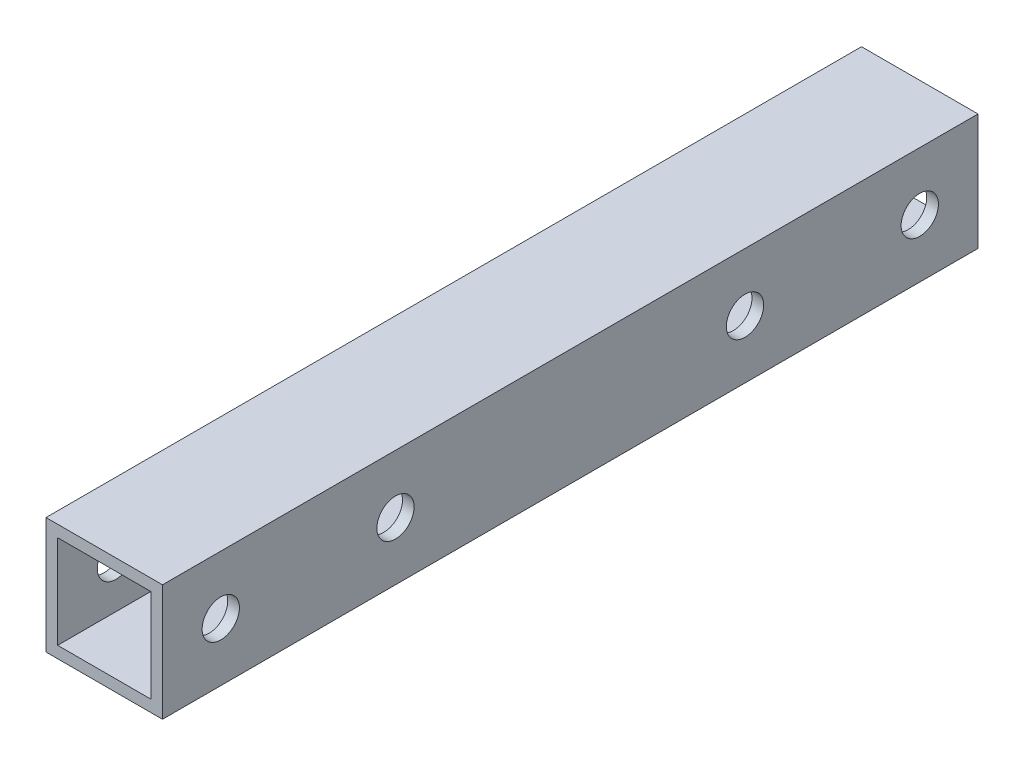
ISO-10303-21;
HEADER;
FILE_DESCRIPTION(('STEP AP214'),'2;1');
FILE_NAME('part.step','',(''),(''),'','','');
FILE_SCHEMA(('AUTOMOTIVE_DESIGN { 1 0 10303 214 1 1 1 1 }'));
ENDSEC;
DATA;
#1=APPLICATION_CONTEXT('core data for automotive mechanical design processes');
#2=APPLICATION_PROTOCOL_DEFINITION('international standard','automotive_design',2000,#1);
#3=PRODUCT_CONTEXT('',#1,'mechanical');
#4=PRODUCT('Part','Part','',(#3));
#5=PRODUCT_RELATED_PRODUCT_CATEGORY('part','',(#4));
#6=PRODUCT_DEFINITION_FORMATION('','',#4);
#7=PRODUCT_DEFINITION_CONTEXT('part definition',#1,'design');
#8=PRODUCT_DEFINITION('design','',#6,#7);
#9=PRODUCT_DEFINITION_SHAPE('','',#8);
#10=(LENGTH_UNIT() NAMED_UNIT(*) SI_UNIT(.MILLI.,.METRE.));
#11=(NAMED_UNIT(*) PLANE_ANGLE_UNIT() SI_UNIT($,.RADIAN.));
#12=(NAMED_UNIT(*) SI_UNIT($,.STERADIAN.) SOLID_ANGLE_UNIT());
#13=UNCERTAINTY_MEASURE_WITH_UNIT(LENGTH_MEASURE(1.E-05),#10,'distance_accuracy_value','');
#14=(GEOMETRIC_REPRESENTATION_CONTEXT(3) GLOBAL_UNCERTAINTY_ASSIGNED_CONTEXT((#13)) GLOBAL_UNIT_ASSIGNED_CONTEXT((#10,
#11,#12)) REPRESENTATION_CONTEXT('',''));
#15=CARTESIAN_POINT('',(0.,0.,0.));
#16=DIRECTION('',(0.,0.,1.));
#17=DIRECTION('',(1.,0.,0.));
#18=AXIS2_PLACEMENT_3D('',#15,#16,#17);
#19=CARTESIAN_POINT('',(0.,0.,70.));
#20=DIRECTION('',(0.,0.,1.));
#21=DIRECTION('',(1.,0.,0.));
#22=AXIS2_PLACEMENT_3D('',#19,#20,#21);
#23=PLANE('',#22);
#24=DIRECTION('',(0.,1.,0.));
#25=VECTOR('',#24,1.);
#26=CARTESIAN_POINT('',(5.,-5.,70.));
#27=LINE('',#26,#25);
#28=CARTESIAN_POINT('',(5.,-5.,70.));
#29=VERTEX_POINT('',#28);
#30=CARTESIAN_POINT('',(5.,5.,70.));
#31=VERTEX_POINT('',#30);
#32=EDGE_CURVE('E167',#29,#31,#27,.T.);
#33=ORIENTED_EDGE('',*,*,#32,.T.);
#34=DIRECTION('',(-1.,0.,0.));
#35=VECTOR('',#34,1.);
#36=CARTESIAN_POINT('',(-5.,5.,70.));
#37=LINE('',#36,#35);
#38=CARTESIAN_POINT('',(-5.,5.,70.));
#39=VERTEX_POINT('',#38);
#40=EDGE_CURVE('E170',#31,#39,#37,.T.);
#41=ORIENTED_EDGE('',*,*,#40,.T.);
#42=DIRECTION('',(0.,-1.,0.));
#43=VECTOR('',#42,1.);
#44=CARTESIAN_POINT('',(-5.,-5.,70.));
#45=LINE('',#44,#43);
#46=CARTESIAN_POINT('',(-5.,-5.,70.));
#47=VERTEX_POINT('',#46);
#48=EDGE_CURVE('E173',#39,#47,#45,.T.);
#49=ORIENTED_EDGE('',*,*,#48,.T.);
#50=DIRECTION('',(1.,0.,0.));
#51=VECTOR('',#50,1.);
#52=CARTESIAN_POINT('',(-5.,-5.,70.));
#53=LINE('',#52,#51);
#54=EDGE_CURVE('E175',#47,#29,#53,.T.);
#55=ORIENTED_EDGE('',*,*,#54,.T.);
#56=EDGE_LOOP('',(#33,#41,#49,#55));
#57=FACE_BOUND('',#56,.T.);
#58=DIRECTION('',(-1.,0.,0.));
#59=VECTOR('',#58,1.);
#60=CARTESIAN_POINT('',(0.,4.,70.));
#61=LINE('',#60,#59);
#62=CARTESIAN_POINT('',(4.,4.,70.));
#63=VERTEX_POINT('',#62);
#64=CARTESIAN_POINT('',(-4.,4.,70.));
#65=VERTEX_POINT('',#64);
#66=EDGE_CURVE('E137',#63,#65,#61,.T.);
#67=ORIENTED_EDGE('',*,*,#66,.F.);
#68=DIRECTION('',(0.,1.,0.));
#69=VECTOR('',#68,1.);
#70=CARTESIAN_POINT('',(4.,0.,70.));
#71=LINE('',#70,#69);
#72=CARTESIAN_POINT('',(4.,-4.,70.));
#73=VERTEX_POINT('',#72);
#74=EDGE_CURVE('E129',#73,#63,#71,.T.);
#75=ORIENTED_EDGE('',*,*,#74,.F.);
#76=DIRECTION('',(1.,0.,0.));
#77=VECTOR('',#76,1.);
#78=CARTESIAN_POINT('',(0.,-4.,70.));
#79=LINE('',#78,#77);
#80=CARTESIAN_POINT('',(-4.,-4.,70.));
#81=VERTEX_POINT('',#80);
#82=EDGE_CURVE('E151',#81,#73,#79,.T.);
#83=ORIENTED_EDGE('',*,*,#82,.F.);
#84=DIRECTION('',(0.,-1.,0.));
#85=VECTOR('',#84,1.);
#86=CARTESIAN_POINT('',(-4.,0.,70.));
#87=LINE('',#86,#85);
#88=EDGE_CURVE('E149',#65,#81,#87,.T.);
#89=ORIENTED_EDGE('',*,*,#88,.F.);
#90=EDGE_LOOP('',(#67,#75,#83,#89));
#91=FACE_BOUND('',#90,.T.);
#92=ADVANCED_FACE('F62',(#57,#91),#23,.T.);
#93=CARTESIAN_POINT('',(0.,0.,0.));
#94=DIRECTION('',(0.,0.,1.));
#95=DIRECTION('',(1.,0.,0.));
#96=AXIS2_PLACEMENT_3D('',#93,#94,#95);
#97=PLANE('',#96);
#98=DIRECTION('',(0.,1.,0.));
#99=VECTOR('',#98,1.);
#100=CARTESIAN_POINT('',(5.,-5.,0.));
#101=LINE('',#100,#99);
#102=CARTESIAN_POINT('',(5.,-5.,0.));
#103=VERTEX_POINT('',#102);
#104=CARTESIAN_POINT('',(5.,5.,0.));
#105=VERTEX_POINT('',#104);
#106=EDGE_CURVE('E145',#103,#105,#101,.T.);
#107=ORIENTED_EDGE('',*,*,#106,.F.);
#108=DIRECTION('',(1.,0.,0.));
#109=VECTOR('',#108,1.);
#110=CARTESIAN_POINT('',(-5.,-5.,0.));
#111=LINE('',#110,#109);
#112=CARTESIAN_POINT('',(-5.,-5.,0.));
#113=VERTEX_POINT('',#112);
#114=EDGE_CURVE('E171',#113,#103,#111,.T.);
#115=ORIENTED_EDGE('',*,*,#114,.F.);
#116=DIRECTION('',(0.,-1.,0.));
#117=VECTOR('',#116,1.);
#118=CARTESIAN_POINT('',(-5.,-5.,0.));
#119=LINE('',#118,#117);
#120=CARTESIAN_POINT('',(-5.,5.,0.));
#121=VERTEX_POINT('',#120);
#122=EDGE_CURVE('E182',#121,#113,#119,.T.);
#123=ORIENTED_EDGE('',*,*,#122,.F.);
#124=DIRECTION('',(-1.,0.,0.));
#125=VECTOR('',#124,1.);
#126=CARTESIAN_POINT('',(-5.,5.,0.));
#127=LINE('',#126,#125);
#128=EDGE_CURVE('E180',#105,#121,#127,.T.);
#129=ORIENTED_EDGE('',*,*,#128,.F.);
#130=EDGE_LOOP('',(#107,#115,#123,#129));
#131=FACE_BOUND('',#130,.T.);
#132=DIRECTION('',(0.,1.,0.));
#133=VECTOR('',#132,1.);
#134=CARTESIAN_POINT('',(4.,0.,0.));
#135=LINE('',#134,#133);
#136=CARTESIAN_POINT('',(4.,-4.,0.));
#137=VERTEX_POINT('',#136);
#138=CARTESIAN_POINT('',(4.,4.,0.));
#139=VERTEX_POINT('',#138);
#140=EDGE_CURVE('E87',#137,#139,#135,.T.);
#141=ORIENTED_EDGE('',*,*,#140,.T.);
#142=DIRECTION('',(-1.,0.,0.));
#143=VECTOR('',#142,1.);
#144=CARTESIAN_POINT('',(0.,4.,0.));
#145=LINE('',#144,#143);
#146=CARTESIAN_POINT('',(-4.,4.,0.));
#147=VERTEX_POINT('',#146);
#148=EDGE_CURVE('E144',#139,#147,#145,.T.);
#149=ORIENTED_EDGE('',*,*,#148,.T.);
#150=DIRECTION('',(0.,-1.,0.));
#151=VECTOR('',#150,1.);
#152=CARTESIAN_POINT('',(-4.,0.,0.));
#153=LINE('',#152,#151);
#154=CARTESIAN_POINT('',(-4.,-4.,0.));
#155=VERTEX_POINT('',#154);
#156=EDGE_CURVE('E159',#147,#155,#153,.T.);
#157=ORIENTED_EDGE('',*,*,#156,.T.);
#158=DIRECTION('',(1.,0.,0.));
#159=VECTOR('',#158,1.);
#160=CARTESIAN_POINT('',(0.,-4.,0.));
#161=LINE('',#160,#159);
#162=EDGE_CURVE('E138',#155,#137,#161,.T.);
#163=ORIENTED_EDGE('',*,*,#162,.T.);
#164=EDGE_LOOP('',(#141,#149,#157,#163));
#165=FACE_BOUND('',#164,.T.);
#166=ADVANCED_FACE('F257',(#131,#165),#97,.F.);
#167=CARTESIAN_POINT('',(5.,-5.,70.));
#168=DIRECTION('',(-1.,0.,0.));
#169=DIRECTION('',(0.,0.,1.));
#170=AXIS2_PLACEMENT_3D('',#167,#168,#169);
#171=PLANE('',#170);
#172=CARTESIAN_POINT('',(5.,0.,50.));
#173=DIRECTION('',(1.,0.,0.));
#174=DIRECTION('',(0.,0.,-1.));
#175=AXIS2_PLACEMENT_3D('',#172,#173,#174);
#176=CIRCLE('',#175,1.60000000000001);
#177=CARTESIAN_POINT('',(5.,0.,48.4));
#178=VERTEX_POINT('',#177);
#179=EDGE_CURVE('E232',#178,#178,#176,.T.);
#180=ORIENTED_EDGE('',*,*,#179,.F.);
#181=EDGE_LOOP('',(#180));
#182=FACE_BOUND('',#181,.T.);
#183=CARTESIAN_POINT('',(5.,0.,65.));
#184=DIRECTION('',(1.,0.,0.));
#185=DIRECTION('',(0.,0.,-1.));
#186=AXIS2_PLACEMENT_3D('',#183,#184,#185);
#187=CIRCLE('',#186,1.60000000000001);
#188=CARTESIAN_POINT('',(5.,0.,63.4));
#189=VERTEX_POINT('',#188);
#190=EDGE_CURVE('E225',#189,#189,#187,.T.);
#191=ORIENTED_EDGE('',*,*,#190,.F.);
#192=EDGE_LOOP('',(#191));
#193=FACE_BOUND('',#192,.T.);
#194=CARTESIAN_POINT('',(5.,0.,5.));
#195=DIRECTION('',(1.,0.,0.));
#196=DIRECTION('',(0.,0.,-1.));
#197=AXIS2_PLACEMENT_3D('',#194,#195,#196);
#198=CIRCLE('',#197,1.6);
#199=CARTESIAN_POINT('',(5.,0.,3.4));
#200=VERTEX_POINT('',#199);
#201=EDGE_CURVE('E219',#200,#200,#198,.T.);
#202=ORIENTED_EDGE('',*,*,#201,.F.);
#203=EDGE_LOOP('',(#202));
#204=FACE_BOUND('',#203,.T.);
#205=CARTESIAN_POINT('',(5.,0.,20.));
#206=DIRECTION('',(1.,0.,0.));
#207=DIRECTION('',(0.,0.,-1.));
#208=AXIS2_PLACEMENT_3D('',#205,#206,#207);
#209=CIRCLE('',#208,1.6);
#210=CARTESIAN_POINT('',(5.,0.,18.4));
#211=VERTEX_POINT('',#210);
#212=EDGE_CURVE('E212',#211,#211,#209,.T.);
#213=ORIENTED_EDGE('',*,*,#212,.F.);
#214=EDGE_LOOP('',(#213));
#215=FACE_BOUND('',#214,.T.);
#216=ORIENTED_EDGE('',*,*,#106,.T.);
#217=DIRECTION('',(0.,0.,-1.));
#218=VECTOR('',#217,1.);
#219=CARTESIAN_POINT('',(5.,5.,70.));
#220=LINE('',#219,#218);
#221=EDGE_CURVE('E12',#31,#105,#220,.T.);
#222=ORIENTED_EDGE('',*,*,#221,.F.);
#223=ORIENTED_EDGE('',*,*,#32,.F.);
#224=DIRECTION('',(0.,0.,-1.));
#225=VECTOR('',#224,1.);
#226=CARTESIAN_POINT('',(5.,-5.,70.));
#227=LINE('',#226,#225);
#228=EDGE_CURVE('E177',#29,#103,#227,.T.);
#229=ORIENTED_EDGE('',*,*,#228,.T.);
#230=EDGE_LOOP('',(#216,#222,#223,#229));
#231=FACE_BOUND('',#230,.T.);
#232=ADVANCED_FACE('F64',(#182,#193,#204,#215,#231),#171,.F.);
#233=CARTESIAN_POINT('',(-5.,5.,70.));
#234=DIRECTION('',(0.,-1.,0.));
#235=DIRECTION('',(0.,0.,-1.));
#236=AXIS2_PLACEMENT_3D('',#233,#234,#235);
#237=PLANE('',#236);
#238=ORIENTED_EDGE('',*,*,#128,.T.);
#239=DIRECTION('',(0.,0.,-1.));
#240=VECTOR('',#239,1.);
#241=CARTESIAN_POINT('',(-5.,5.,70.));
#242=LINE('',#241,#240);
#243=EDGE_CURVE('E71',#39,#121,#242,.T.);
#244=ORIENTED_EDGE('',*,*,#243,.F.);
#245=ORIENTED_EDGE('',*,*,#40,.F.);
#246=ORIENTED_EDGE('',*,*,#221,.T.);
#247=EDGE_LOOP('',(#238,#244,#245,#246));
#248=FACE_BOUND('',#247,.T.);
#249=ADVANCED_FACE('F285',(#248),#237,.F.);
#250=CARTESIAN_POINT('',(-5.,-5.,70.));
#251=DIRECTION('',(1.,0.,0.));
#252=DIRECTION('',(0.,0.,-1.));
#253=AXIS2_PLACEMENT_3D('',#250,#251,#252);
#254=PLANE('',#253);
#255=CARTESIAN_POINT('',(-5.,0.,50.));
#256=DIRECTION('',(1.,0.,0.));
#257=DIRECTION('',(0.,0.,-1.));
#258=AXIS2_PLACEMENT_3D('',#255,#256,#257);
#259=CIRCLE('',#258,1.60000000000001);
#260=CARTESIAN_POINT('',(-5.,0.,48.4));
#261=VERTEX_POINT('',#260);
#262=EDGE_CURVE('E235',#261,#261,#259,.T.);
#263=ORIENTED_EDGE('',*,*,#262,.T.);
#264=EDGE_LOOP('',(#263));
#265=FACE_BOUND('',#264,.T.);
#266=CARTESIAN_POINT('',(-5.,0.,65.));
#267=DIRECTION('',(1.,0.,0.));
#268=DIRECTION('',(0.,0.,-1.));
#269=AXIS2_PLACEMENT_3D('',#266,#267,#268);
#270=CIRCLE('',#269,1.60000000000001);
#271=CARTESIAN_POINT('',(-5.,0.,63.4));
#272=VERTEX_POINT('',#271);
#273=EDGE_CURVE('E196',#272,#272,#270,.T.);
#274=ORIENTED_EDGE('',*,*,#273,.T.);
#275=EDGE_LOOP('',(#274));
#276=FACE_BOUND('',#275,.T.);
#277=CARTESIAN_POINT('',(-5.,0.,5.));
#278=DIRECTION('',(1.,0.,0.));
#279=DIRECTION('',(0.,0.,-1.));
#280=AXIS2_PLACEMENT_3D('',#277,#278,#279);
#281=CIRCLE('',#280,1.6);
#282=CARTESIAN_POINT('',(-5.,0.,3.4));
#283=VERTEX_POINT('',#282);
#284=EDGE_CURVE('E222',#283,#283,#281,.T.);
#285=ORIENTED_EDGE('',*,*,#284,.T.);
#286=EDGE_LOOP('',(#285));
#287=FACE_BOUND('',#286,.T.);
#288=CARTESIAN_POINT('',(-5.,0.,20.));
#289=DIRECTION('',(1.,0.,0.));
#290=DIRECTION('',(0.,0.,-1.));
#291=AXIS2_PLACEMENT_3D('',#288,#289,#290);
#292=CIRCLE('',#291,1.6);
#293=CARTESIAN_POINT('',(-5.,0.,18.4));
#294=VERTEX_POINT('',#293);
#295=EDGE_CURVE('E215',#294,#294,#292,.T.);
#296=ORIENTED_EDGE('',*,*,#295,.T.);
#297=EDGE_LOOP('',(#296));
#298=FACE_BOUND('',#297,.T.);
#299=ORIENTED_EDGE('',*,*,#122,.T.);
#300=DIRECTION('',(0.,0.,-1.));
#301=VECTOR('',#300,1.);
#302=CARTESIAN_POINT('',(-5.,-5.,70.));
#303=LINE('',#302,#301);
#304=EDGE_CURVE('E187',#47,#113,#303,.T.);
#305=ORIENTED_EDGE('',*,*,#304,.F.);
#306=ORIENTED_EDGE('',*,*,#48,.F.);
#307=ORIENTED_EDGE('',*,*,#243,.T.);
#308=EDGE_LOOP('',(#299,#305,#306,#307));
#309=FACE_BOUND('',#308,.T.);
#310=ADVANCED_FACE('F282',(#265,#276,#287,#298,#309),#254,.F.);
#311=CARTESIAN_POINT('',(-5.,-5.,70.));
#312=DIRECTION('',(0.,1.,0.));
#313=DIRECTION('',(0.,0.,1.));
#314=AXIS2_PLACEMENT_3D('',#311,#312,#313);
#315=PLANE('',#314);
#316=ORIENTED_EDGE('',*,*,#114,.T.);
#317=ORIENTED_EDGE('',*,*,#228,.F.);
#318=ORIENTED_EDGE('',*,*,#54,.F.);
#319=ORIENTED_EDGE('',*,*,#304,.T.);
#320=EDGE_LOOP('',(#316,#317,#318,#319));
#321=FACE_BOUND('',#320,.T.);
#322=ADVANCED_FACE('F279',(#321),#315,.F.);
#323=CARTESIAN_POINT('',(4.,0.,70.));
#324=DIRECTION('',(-1.,0.,0.));
#325=DIRECTION('',(0.,0.,1.));
#326=AXIS2_PLACEMENT_3D('',#323,#324,#325);
#327=PLANE('',#326);
#328=CARTESIAN_POINT('',(4.,0.,50.));
#329=DIRECTION('',(-1.,0.,0.));
#330=DIRECTION('',(0.,0.,1.));
#331=AXIS2_PLACEMENT_3D('',#328,#329,#330);
#332=CIRCLE('',#331,1.60000000000001);
#333=CARTESIAN_POINT('',(4.,0.,51.6));
#334=VERTEX_POINT('',#333);
#335=EDGE_CURVE('E216',#334,#334,#332,.T.);
#336=ORIENTED_EDGE('',*,*,#335,.F.);
#337=EDGE_LOOP('',(#336));
#338=FACE_BOUND('',#337,.T.);
#339=CARTESIAN_POINT('',(4.,0.,65.));
#340=DIRECTION('',(-1.,0.,0.));
#341=DIRECTION('',(0.,0.,1.));
#342=AXIS2_PLACEMENT_3D('',#339,#340,#341);
#343=CIRCLE('',#342,1.60000000000001);
#344=CARTESIAN_POINT('',(4.,0.,66.6));
#345=VERTEX_POINT('',#344);
#346=EDGE_CURVE('E157',#345,#345,#343,.T.);
#347=ORIENTED_EDGE('',*,*,#346,.F.);
#348=EDGE_LOOP('',(#347));
#349=FACE_BOUND('',#348,.T.);
#350=CARTESIAN_POINT('',(4.,0.,5.));
#351=DIRECTION('',(-1.,0.,0.));
#352=DIRECTION('',(0.,0.,1.));
#353=AXIS2_PLACEMENT_3D('',#350,#351,#352);
#354=CIRCLE('',#353,1.6);
#355=CARTESIAN_POINT('',(4.,0.,6.6));
#356=VERTEX_POINT('',#355);
#357=EDGE_CURVE('E199',#356,#356,#354,.T.);
#358=ORIENTED_EDGE('',*,*,#357,.F.);
#359=EDGE_LOOP('',(#358));
#360=FACE_BOUND('',#359,.T.);
#361=CARTESIAN_POINT('',(4.,0.,20.));
#362=DIRECTION('',(-1.,0.,0.));
#363=DIRECTION('',(0.,0.,1.));
#364=AXIS2_PLACEMENT_3D('',#361,#362,#363);
#365=CIRCLE('',#364,1.6);
#366=CARTESIAN_POINT('',(4.,0.,21.6));
#367=VERTEX_POINT('',#366);
#368=EDGE_CURVE('E195',#367,#367,#365,.T.);
#369=ORIENTED_EDGE('',*,*,#368,.F.);
#370=EDGE_LOOP('',(#369));
#371=FACE_BOUND('',#370,.T.);
#372=ORIENTED_EDGE('',*,*,#140,.F.);
#373=DIRECTION('',(0.,0.,-1.));
#374=VECTOR('',#373,1.);
#375=CARTESIAN_POINT('',(4.,-4.,70.));
#376=LINE('',#375,#374);
#377=EDGE_CURVE('E133',#73,#137,#376,.T.);
#378=ORIENTED_EDGE('',*,*,#377,.F.);
#379=ORIENTED_EDGE('',*,*,#74,.T.);
#380=DIRECTION('',(0.,0.,-1.));
#381=VECTOR('',#380,1.);
#382=CARTESIAN_POINT('',(4.,4.,70.));
#383=LINE('',#382,#381);
#384=EDGE_CURVE('E132',#63,#139,#383,.T.);
#385=ORIENTED_EDGE('',*,*,#384,.T.);
#386=EDGE_LOOP('',(#372,#378,#379,#385));
#387=FACE_BOUND('',#386,.T.);
#388=ADVANCED_FACE('F131',(#338,#349,#360,#371,#387),#327,.T.);
#389=CARTESIAN_POINT('',(0.,4.,70.));
#390=DIRECTION('',(0.,-1.,0.));
#391=DIRECTION('',(0.,0.,-1.));
#392=AXIS2_PLACEMENT_3D('',#389,#390,#391);
#393=PLANE('',#392);
#394=ORIENTED_EDGE('',*,*,#148,.F.);
#395=ORIENTED_EDGE('',*,*,#384,.F.);
#396=ORIENTED_EDGE('',*,*,#66,.T.);
#397=DIRECTION('',(0.,0.,-1.));
#398=VECTOR('',#397,1.);
#399=CARTESIAN_POINT('',(-4.,4.,70.));
#400=LINE('',#399,#398);
#401=EDGE_CURVE('E146',#65,#147,#400,.T.);
#402=ORIENTED_EDGE('',*,*,#401,.T.);
#403=EDGE_LOOP('',(#394,#395,#396,#402));
#404=FACE_BOUND('',#403,.T.);
#405=ADVANCED_FACE('F141',(#404),#393,.T.);
#406=CARTESIAN_POINT('',(-4.,0.,70.));
#407=DIRECTION('',(1.,0.,0.));
#408=DIRECTION('',(0.,0.,-1.));
#409=AXIS2_PLACEMENT_3D('',#406,#407,#408);
#410=PLANE('',#409);
#411=CARTESIAN_POINT('',(-4.,0.,50.));
#412=DIRECTION('',(1.,0.,0.));
#413=DIRECTION('',(0.,0.,-1.));
#414=AXIS2_PLACEMENT_3D('',#411,#412,#413);
#415=CIRCLE('',#414,1.60000000000001);
#416=CARTESIAN_POINT('',(-4.,0.,48.4));
#417=VERTEX_POINT('',#416);
#418=EDGE_CURVE('E66',#417,#417,#415,.T.);
#419=ORIENTED_EDGE('',*,*,#418,.F.);
#420=EDGE_LOOP('',(#419));
#421=FACE_BOUND('',#420,.T.);
#422=CARTESIAN_POINT('',(-4.,0.,65.));
#423=DIRECTION('',(1.,0.,0.));
#424=DIRECTION('',(0.,0.,-1.));
#425=AXIS2_PLACEMENT_3D('',#422,#423,#424);
#426=CIRCLE('',#425,1.60000000000001);
#427=CARTESIAN_POINT('',(-4.,0.,63.4));
#428=VERTEX_POINT('',#427);
#429=EDGE_CURVE('E200',#428,#428,#426,.T.);
#430=ORIENTED_EDGE('',*,*,#429,.F.);
#431=EDGE_LOOP('',(#430));
#432=FACE_BOUND('',#431,.T.);
#433=CARTESIAN_POINT('',(-4.,0.,5.));
#434=DIRECTION('',(1.,0.,0.));
#435=DIRECTION('',(0.,0.,-1.));
#436=AXIS2_PLACEMENT_3D('',#433,#434,#435);
#437=CIRCLE('',#436,1.6);
#438=CARTESIAN_POINT('',(-4.,0.,3.4));
#439=VERTEX_POINT('',#438);
#440=EDGE_CURVE('E197',#439,#439,#437,.T.);
#441=ORIENTED_EDGE('',*,*,#440,.F.);
#442=EDGE_LOOP('',(#441));
#443=FACE_BOUND('',#442,.T.);
#444=CARTESIAN_POINT('',(-4.,0.,20.));
#445=DIRECTION('',(1.,0.,0.));
#446=DIRECTION('',(0.,0.,-1.));
#447=AXIS2_PLACEMENT_3D('',#444,#445,#446);
#448=CIRCLE('',#447,1.6);
#449=CARTESIAN_POINT('',(-4.,0.,18.4));
#450=VERTEX_POINT('',#449);
#451=EDGE_CURVE('E192',#450,#450,#448,.T.);
#452=ORIENTED_EDGE('',*,*,#451,.F.);
#453=EDGE_LOOP('',(#452));
#454=FACE_BOUND('',#453,.T.);
#455=ORIENTED_EDGE('',*,*,#156,.F.);
#456=ORIENTED_EDGE('',*,*,#401,.F.);
#457=ORIENTED_EDGE('',*,*,#88,.T.);
#458=DIRECTION('',(0.,0.,-1.));
#459=VECTOR('',#458,1.);
#460=CARTESIAN_POINT('',(-4.,-4.,70.));
#461=LINE('',#460,#459);
#462=EDGE_CURVE('E79',#81,#155,#461,.T.);
#463=ORIENTED_EDGE('',*,*,#462,.T.);
#464=EDGE_LOOP('',(#455,#456,#457,#463));
#465=FACE_BOUND('',#464,.T.);
#466=ADVANCED_FACE('F245',(#421,#432,#443,#454,#465),#410,.T.);
#467=CARTESIAN_POINT('',(0.,-4.,70.));
#468=DIRECTION('',(0.,1.,0.));
#469=DIRECTION('',(0.,0.,1.));
#470=AXIS2_PLACEMENT_3D('',#467,#468,#469);
#471=PLANE('',#470);
#472=ORIENTED_EDGE('',*,*,#162,.F.);
#473=ORIENTED_EDGE('',*,*,#462,.F.);
#474=ORIENTED_EDGE('',*,*,#82,.T.);
#475=ORIENTED_EDGE('',*,*,#377,.T.);
#476=EDGE_LOOP('',(#472,#473,#474,#475));
#477=FACE_BOUND('',#476,.T.);
#478=ADVANCED_FACE('F248',(#477),#471,.T.);
#479=CARTESIAN_POINT('',(-5.,0.,20.));
#480=DIRECTION('',(1.,0.,0.));
#481=DIRECTION('',(0.,0.,-1.));
#482=AXIS2_PLACEMENT_3D('',#479,#480,#481);
#483=CYLINDRICAL_SURFACE('',#482,1.6);
#484=ORIENTED_EDGE('',*,*,#451,.T.);
#485=EDGE_LOOP('',(#484));
#486=FACE_BOUND('',#485,.T.);
#487=ORIENTED_EDGE('',*,*,#295,.F.);
#488=EDGE_LOOP('',(#487));
#489=FACE_BOUND('',#488,.T.);
#490=ADVANCED_FACE('F259',(#486,#489),#483,.F.);
#491=CARTESIAN_POINT('',(-5.,0.,5.));
#492=DIRECTION('',(1.,0.,0.));
#493=DIRECTION('',(0.,0.,-1.));
#494=AXIS2_PLACEMENT_3D('',#491,#492,#493);
#495=CYLINDRICAL_SURFACE('',#494,1.6);
#496=ORIENTED_EDGE('',*,*,#440,.T.);
#497=EDGE_LOOP('',(#496));
#498=FACE_BOUND('',#497,.T.);
#499=ORIENTED_EDGE('',*,*,#284,.F.);
#500=EDGE_LOOP('',(#499));
#501=FACE_BOUND('',#500,.T.);
#502=ADVANCED_FACE('F264',(#498,#501),#495,.F.);
#503=CARTESIAN_POINT('',(-5.,0.,65.));
#504=DIRECTION('',(1.,0.,0.));
#505=DIRECTION('',(0.,0.,-1.));
#506=AXIS2_PLACEMENT_3D('',#503,#504,#505);
#507=CYLINDRICAL_SURFACE('',#506,1.60000000000001);
#508=ORIENTED_EDGE('',*,*,#429,.T.);
#509=EDGE_LOOP('',(#508));
#510=FACE_BOUND('',#509,.T.);
#511=ORIENTED_EDGE('',*,*,#273,.F.);
#512=EDGE_LOOP('',(#511));
#513=FACE_BOUND('',#512,.T.);
#514=ADVANCED_FACE('F316',(#510,#513),#507,.F.);
#515=ORIENTED_EDGE('',*,*,#368,.T.);
#516=EDGE_LOOP('',(#515));
#517=FACE_BOUND('',#516,.T.);
#518=ORIENTED_EDGE('',*,*,#212,.T.);
#519=EDGE_LOOP('',(#518));
#520=FACE_BOUND('',#519,.T.);
#521=ADVANCED_FACE('F267',(#517,#520),#483,.F.);
#522=ORIENTED_EDGE('',*,*,#357,.T.);
#523=EDGE_LOOP('',(#522));
#524=FACE_BOUND('',#523,.T.);
#525=ORIENTED_EDGE('',*,*,#201,.T.);
#526=EDGE_LOOP('',(#525));
#527=FACE_BOUND('',#526,.T.);
#528=ADVANCED_FACE('F315',(#524,#527),#495,.F.);
#529=ORIENTED_EDGE('',*,*,#346,.T.);
#530=EDGE_LOOP('',(#529));
#531=FACE_BOUND('',#530,.T.);
#532=ORIENTED_EDGE('',*,*,#190,.T.);
#533=EDGE_LOOP('',(#532));
#534=FACE_BOUND('',#533,.T.);
#535=ADVANCED_FACE('F322',(#531,#534),#507,.F.);
#536=CARTESIAN_POINT('',(-5.,0.,50.));
#537=DIRECTION('',(1.,0.,0.));
#538=DIRECTION('',(0.,0.,-1.));
#539=AXIS2_PLACEMENT_3D('',#536,#537,#538);
#540=CYLINDRICAL_SURFACE('',#539,1.60000000000001);
#541=ORIENTED_EDGE('',*,*,#418,.T.);
#542=EDGE_LOOP('',(#541));
#543=FACE_BOUND('',#542,.T.);
#544=ORIENTED_EDGE('',*,*,#262,.F.);
#545=EDGE_LOOP('',(#544));
#546=FACE_BOUND('',#545,.T.);
#547=ADVANCED_FACE('F242',(#543,#546),#540,.F.);
#548=ORIENTED_EDGE('',*,*,#335,.T.);
#549=EDGE_LOOP('',(#548));
#550=FACE_BOUND('',#549,.T.);
#551=ORIENTED_EDGE('',*,*,#179,.T.);
#552=EDGE_LOOP('',(#551));
#553=FACE_BOUND('',#552,.T.);
#554=ADVANCED_FACE('F329',(#550,#553),#540,.F.);
#555=CLOSED_SHELL('',(#92,#166,#232,#249,#310,#322,#388,#405,#466,#478,#490,#502,#514,#521,#528,
#535,#547,#554));
#556=MANIFOLD_SOLID_BREP('B2',#555);
#557=ADVANCED_BREP_SHAPE_REPRESENTATION('',(#18,#556),#14);
#558=SHAPE_DEFINITION_REPRESENTATION(#9,#557);
ENDSEC;
END-ISO-10303-21;
